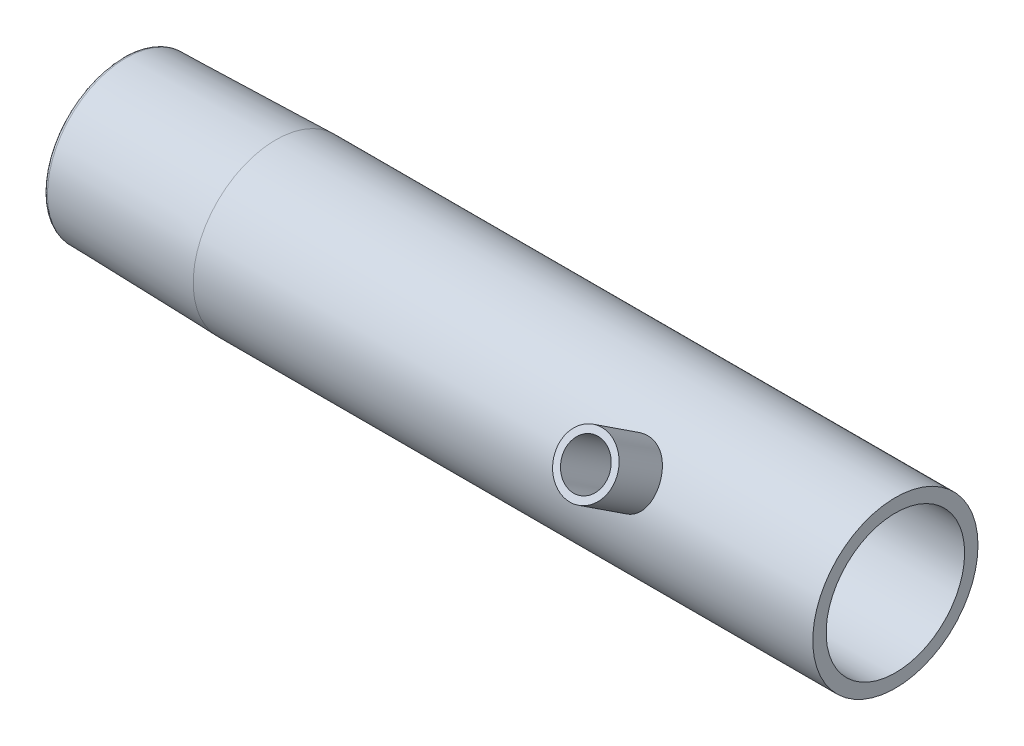
ISO-10303-21;
HEADER;
FILE_DESCRIPTION(('STEP AP214'),'2;1');
FILE_NAME('part.step','',(''),(''),'','','');
FILE_SCHEMA(('AUTOMOTIVE_DESIGN { 1 0 10303 214 1 1 1 1 }'));
ENDSEC;
DATA;
#1=APPLICATION_CONTEXT('core data for automotive mechanical design processes');
#2=APPLICATION_PROTOCOL_DEFINITION('international standard','automotive_design',2000,#1);
#3=PRODUCT_CONTEXT('',#1,'mechanical');
#4=PRODUCT('Part','Part','',(#3));
#5=PRODUCT_RELATED_PRODUCT_CATEGORY('part','',(#4));
#6=PRODUCT_DEFINITION_FORMATION('','',#4);
#7=PRODUCT_DEFINITION_CONTEXT('part definition',#1,'design');
#8=PRODUCT_DEFINITION('design','',#6,#7);
#9=PRODUCT_DEFINITION_SHAPE('','',#8);
#10=(LENGTH_UNIT() NAMED_UNIT(*) SI_UNIT(.MILLI.,.METRE.));
#11=(NAMED_UNIT(*) PLANE_ANGLE_UNIT() SI_UNIT($,.RADIAN.));
#12=(NAMED_UNIT(*) SI_UNIT($,.STERADIAN.) SOLID_ANGLE_UNIT());
#13=UNCERTAINTY_MEASURE_WITH_UNIT(LENGTH_MEASURE(1.E-05),#10,'distance_accuracy_value','');
#14=(GEOMETRIC_REPRESENTATION_CONTEXT(3) GLOBAL_UNCERTAINTY_ASSIGNED_CONTEXT((#13)) GLOBAL_UNIT_ASSIGNED_CONTEXT((#10,
#11,#12)) REPRESENTATION_CONTEXT('',''));
#15=CARTESIAN_POINT('',(0.,0.,0.));
#16=DIRECTION('',(0.,0.,1.));
#17=DIRECTION('',(1.,0.,0.));
#18=AXIS2_PLACEMENT_3D('',#15,#16,#17);
#19=CARTESIAN_POINT('',(0.,5.12249620092513,7.80398985559965));
#20=DIRECTION('',(0.,0.548740889149092,0.835992485956581));
#21=DIRECTION('',(0.,-0.835992485956581,0.548740889149092));
#22=AXIS2_PLACEMENT_3D('',#19,#20,#21);
#23=PLANE('',#22);
#24=DIRECTION('',(1.,0.,0.));
#25=VECTOR('',#24,1.);
#26=CARTESIAN_POINT('',(-44.1959971224861,3.64873486396762,8.77135872556055));
#27=LINE('',#26,#25);
#28=CARTESIAN_POINT('',(67.9620369406274,3.64873486361647,8.77135872502559));
#29=VERTEX_POINT('',#28);
#30=CARTESIAN_POINT('',(66.9470794203548,3.6487348639676,8.77135872556056));
#31=VERTEX_POINT('',#30);
#32=EDGE_CURVE('E56',#29,#31,#27,.F.);
#33=ORIENTED_EDGE('',*,*,#32,.T.);
#34=CARTESIAN_POINT('',(64.1551590265183,4.67523033592266,8.09757271976458));
#35=DIRECTION('',(0.,0.548740889149092,0.835992485956581));
#36=DIRECTION('',(0.,-0.835992485956581,0.548740889149092));
#37=AXIS2_PLACEMENT_3D('',#34,#35,#36);
#38=CIRCLE('',#37,3.05000000345426);
#39=CARTESIAN_POINT('',(66.1606901891249,6.59625753613996,6.83662098678264));
#40=VERTEX_POINT('',#39);
#41=EDGE_CURVE('E12',#31,#40,#38,.T.);
#42=ORIENTED_EDGE('',*,*,#41,.T.);
#43=DIRECTION('',(1.,0.,0.));
#44=VECTOR('',#43,1.);
#45=CARTESIAN_POINT('',(-44.1959971224861,6.59625753613994,6.83662098678265));
#46=LINE('',#45,#44);
#47=CARTESIAN_POINT('',(67.4292474866354,6.59625753679708,6.8366209877838));
#48=VERTEX_POINT('',#47);
#49=EDGE_CURVE('E84',#40,#48,#46,.T.);
#50=ORIENTED_EDGE('',*,*,#49,.T.);
#51=CARTESIAN_POINT('',(64.1551590265184,4.67523033984378,8.09757271719077));
#52=DIRECTION('',(0.,0.548740888713413,0.835992486242558));
#53=DIRECTION('',(0.,-0.835992486242558,0.548740888713414));
#54=AXIS2_PLACEMENT_3D('',#51,#52,#53);
#55=CIRCLE('',#54,4.00000000000001);
#56=EDGE_CURVE('E103',#29,#48,#55,.T.);
#57=ORIENTED_EDGE('',*,*,#56,.F.);
#58=EDGE_LOOP('',(#33,#42,#50,#57));
#59=FACE_BOUND('',#58,.T.);
#60=ADVANCED_FACE('F34',(#59),#23,.F.);
#61=CARTESIAN_POINT('',(-44.1959971224861,0.,0.));
#62=DIRECTION('',(1.,0.,0.));
#63=DIRECTION('',(0.,0.,-1.));
#64=AXIS2_PLACEMENT_3D('',#61,#62,#63);
#65=CYLINDRICAL_SURFACE('',#64,9.5);
#66=CARTESIAN_POINT('',(91.,0.,0.));
#67=DIRECTION('',(1.,0.,0.));
#68=DIRECTION('',(0.,0.,-1.));
#69=AXIS2_PLACEMENT_3D('',#66,#67,#68);
#70=CIRCLE('',#69,9.5);
#71=CARTESIAN_POINT('',(91.,0.,-9.5));
#72=VERTEX_POINT('',#71);
#73=EDGE_CURVE('E114',#72,#72,#70,.T.);
#74=ORIENTED_EDGE('',*,*,#73,.T.);
#75=EDGE_LOOP('',(#74));
#76=FACE_BOUND('',#75,.T.);
#77=CARTESIAN_POINT('',(-14.5,0.,0.));
#78=DIRECTION('',(1.,0.,0.));
#79=DIRECTION('',(0.,0.,-1.));
#80=AXIS2_PLACEMENT_3D('',#77,#78,#79);
#81=CIRCLE('',#80,9.5);
#82=CARTESIAN_POINT('',(-14.5,0.,-9.5));
#83=VERTEX_POINT('',#82);
#84=EDGE_CURVE('E163',#83,#83,#81,.F.);
#85=ORIENTED_EDGE('',*,*,#84,.T.);
#86=EDGE_LOOP('',(#85));
#87=FACE_BOUND('',#86,.T.);
#88=ORIENTED_EDGE('',*,*,#49,.F.);
#89=CARTESIAN_POINT('',(64.1551590265183,1.83055754077954,9.32196648191223));
#90=CARTESIAN_POINT('',(64.3194069724884,1.83055773345864,9.32196664932546));
#91=CARTESIAN_POINT('',(64.4836578336241,1.84468800655994,9.31922501446892));
#92=CARTESIAN_POINT('',(64.8072477269291,1.90037290600807,9.30802703055967));
#93=CARTESIAN_POINT('',(64.9665854088889,1.94193500191815,9.29956912497684));
#94=CARTESIAN_POINT('',(65.2755389804409,2.05008597221565,9.27632301268519));
#95=CARTESIAN_POINT('',(65.425177607279,2.11661363336963,9.26155027712532));
#96=CARTESIAN_POINT('',(65.7116270010047,2.27161345908223,9.22475446388282));
#97=CARTESIAN_POINT('',(65.8484348016597,2.36009068079576,9.20272971496096));
#98=CARTESIAN_POINT('',(66.1120447283323,2.55989235971579,9.14921254717054));
#99=CARTESIAN_POINT('',(66.2381342148522,2.67205592676818,9.11734362684915));
#100=CARTESIAN_POINT('',(66.4703573591307,2.91254646236125,9.04338918184039));
#101=CARTESIAN_POINT('',(66.5764859793552,3.04087749748576,9.0013010842572));
#102=CARTESIAN_POINT('',(66.7703174290475,3.31542306270465,8.903934977784));
#103=CARTESIAN_POINT('',(66.8570194696255,3.4621723122406,8.84816338484763));
#104=CARTESIAN_POINT('',(67.003090689641,3.76379174088539,8.72412854086039));
#105=CARTESIAN_POINT('',(67.0624651182799,3.91866035402157,8.6558676923211));
#106=CARTESIAN_POINT('',(67.1503456740538,4.2269109975065,8.50949542326519));
#107=CARTESIAN_POINT('',(67.1796595559945,4.38021582383399,8.43170837989692));
#108=CARTESIAN_POINT('',(67.2088784079783,4.68443562603211,8.26655782104833));
#109=CARTESIAN_POINT('',(67.2087932910646,4.83535139030493,8.17919754349793));
#110=CARTESIAN_POINT('',(67.1796994389063,5.12280835819424,8.00212259418471));
#111=CARTESIAN_POINT('',(67.1520967079458,5.25969170728326,7.91272873072002));
#112=CARTESIAN_POINT('',(67.0708569378575,5.52337532977957,7.7309749636817));
#113=CARTESIAN_POINT('',(67.0172201788045,5.65017571164258,7.63861509202645));
#114=CARTESIAN_POINT('',(66.8858071337893,5.89046024467732,7.45488423067936));
#115=CARTESIAN_POINT('',(66.8081190393953,6.00399099132725,7.36351087020469));
#116=CARTESIAN_POINT('',(66.6307571019932,6.21636000428591,7.18513241910146));
#117=CARTESIAN_POINT('',(66.5310788234006,6.31519529967008,7.09812821411689));
#118=CARTESIAN_POINT('',(66.3083539560822,6.50018550396126,6.92920354138024));
#119=CARTESIAN_POINT('',(66.1845920467289,6.58575185262156,6.84758112589768));
#120=CARTESIAN_POINT('',(65.9194241209659,6.73882427517402,6.69699974715508));
#121=CARTESIAN_POINT('',(65.7780154927287,6.80632767097356,6.62804266218728));
#122=CARTESIAN_POINT('',(65.4782278841157,6.92377440386712,6.5052852072969));
#123=CARTESIAN_POINT('',(65.3195708858579,6.97334812217903,6.45180796602954));
#124=CARTESIAN_POINT('',(64.9920601737962,7.05252972857976,6.36516322453285));
#125=CARTESIAN_POINT('',(64.8232088100542,7.08214219924338,6.33199106295486));
#126=CARTESIAN_POINT('',(64.484636814317,7.12058089435784,6.28873224356802));
#127=CARTESIAN_POINT('',(64.3150452049205,7.12991190010147,6.27808514866403));
#128=CARTESIAN_POINT('',(63.9759725548951,7.12917490255555,6.27892259814476));
#129=CARTESIAN_POINT('',(63.8064915030204,7.11910934527435,6.29040435196562));
#130=CARTESIAN_POINT('',(63.4764961357015,7.08016214804403,6.33420220466674));
#131=CARTESIAN_POINT('',(63.3158653681566,7.05171653728768,6.36603532834494));
#132=CARTESIAN_POINT('',(63.0038023736153,6.97673138342758,6.44812281671684));
#133=CARTESIAN_POINT('',(62.8523714427111,6.93018929765779,6.49837977001516));
#134=CARTESIAN_POINT('',(62.5595022044709,6.81828445288229,6.61571460421642));
#135=CARTESIAN_POINT('',(62.418338218988,6.75254936542967,6.6831214847471));
#136=CARTESIAN_POINT('',(62.1530882958223,6.60326618003022,6.83065634049128));
#137=CARTESIAN_POINT('',(62.0290056659241,6.51971463991062,6.91078677315438));
#138=CARTESIAN_POINT('',(61.7979096829791,6.33309286362322,7.08225969826534));
#139=CARTESIAN_POINT('',(61.6914651550322,6.22954557127635,7.1738515073077));
#140=CARTESIAN_POINT('',(61.5030439623949,6.0060002709448,7.36201509774213));
#141=CARTESIAN_POINT('',(61.4210642517885,5.88600431356706,7.45858625743837));
#142=CARTESIAN_POINT('',(61.2852488693817,5.6338317549295,7.65079440359298));
#143=CARTESIAN_POINT('',(61.2309923552515,5.50187546135367,7.74642231926321));
#144=CARTESIAN_POINT('',(61.1505174258389,5.22739732820681,7.9342251620966));
#145=CARTESIAN_POINT('',(61.1242912972657,5.08487840676722,8.02640103243946));
#146=CARTESIAN_POINT('',(61.1010731525341,4.79871229787552,8.20057259184177));
#147=CARTESIAN_POINT('',(61.1030386804199,4.65530055422768,8.28281835106436));
#148=CARTESIAN_POINT('',(61.1333610846331,4.36657039516593,8.43860038578781));
#149=CARTESIAN_POINT('',(61.1617181562693,4.22125196564956,8.51213659682975));
#150=CARTESIAN_POINT('',(61.243681640571,3.93283344637632,8.64918302578005));
#151=CARTESIAN_POINT('',(61.2973198200523,3.78973638219546,8.71268049513773));
#152=CARTESIAN_POINT('',(61.4280519211532,3.51009663388764,8.82905368234405));
#153=CARTESIAN_POINT('',(61.5051513400782,3.37355549459881,8.88192690595322));
#154=CARTESIAN_POINT('',(61.684784694537,3.10483954837493,8.97949635659194));
#155=CARTESIAN_POINT('',(61.7883369454293,2.97316518160799,9.02369636416609));
#156=CARTESIAN_POINT('',(62.01622152095,2.72555863264227,9.1015497559261));
#157=CARTESIAN_POINT('',(62.1405614181133,2.60963221511004,9.1351992838864));
#158=CARTESIAN_POINT('',(62.4118415797248,2.3940118682474,9.19410953972507));
#159=CARTESIAN_POINT('',(62.5594188184141,2.29502507354959,9.21903676850579));
#160=CARTESIAN_POINT('',(62.8700663967209,2.1229585315452,9.26017914726139));
#161=CARTESIAN_POINT('',(63.0331284856367,2.04986508476511,9.27639890647253));
#162=CARTESIAN_POINT('',(63.3544663767341,1.93896085887627,9.30018031472613));
#163=CARTESIAN_POINT('',(63.5117800157281,1.89850355770825,9.30840621204269));
#164=CARTESIAN_POINT('',(63.8311157432677,1.84430702454465,9.31929812660428));
#165=CARTESIAN_POINT('',(63.9931359665313,1.83055735071046,9.32196631676677));
#166=CARTESIAN_POINT('',(64.1551590265183,1.83055754077954,9.32196648191223));
#167=B_SPLINE_CURVE_WITH_KNOTS('',3,(#89,#90,#91,#92,#93,#94,#95,#96,#97,#98,#99,#100,#101,#102,
#103,#104,#105,#106,#107,#108,#109,#110,#111,#112,#113,#114,#115,#116,#117,#118,#119,#120,#121,
#122,#123,#124,#125,#126,#127,#128,#129,#130,#131,#132,#133,#134,#135,#136,#137,#138,#139,#140,
#141,#142,#143,#144,#145,#146,#147,#148,#149,#150,#151,#152,#153,#154,#155,#156,#157,#158,#159,
#160,#161,#162,#163,#164,#165,#166),.UNSPECIFIED.,.T.,.F.,(4,2,2,2,2,2,2,2,2,2,2,2,2,2,2,2,2,2,
2,2,2,2,2,2,2,2,2,2,2,2,2,2,2,2,2,2,2,2,4),(0.,0.492135466083825,0.984404993780647,
1.47547532622363,1.96665890598645,2.4796219845228,2.99271434661773,3.52809737600957,
4.063377523838,4.58386417362068,5.10417532077422,5.59919727099587,6.09421389587716,
6.58743646969399,7.08075862129555,7.59193934644867,8.10319581955723,8.62446050859779,
9.145605488252,9.65362374604057,10.1615779442544,10.6579036165767,11.1542990509234,
11.6610487501916,12.1678964433209,12.6888007234112,13.2096401228497,13.7223188798469,
14.2348565235799,14.7284922868668,15.2221317032981,15.7163930596258,16.2107703177826,
16.7281989107553,17.2458164052456,17.7814864332896,18.3168726279721,18.802531592612,
19.2880006416893),.UNSPECIFIED.);
#168=CARTESIAN_POINT('',(62.1496278639117,6.59625753613994,6.83662098678265));
#169=VERTEX_POINT('',#168);
#170=EDGE_CURVE('E75',#40,#169,#167,.T.);
#171=ORIENTED_EDGE('',*,*,#170,.T.);
#172=CARTESIAN_POINT('',(60.8810705619507,6.59625753149576,6.83662099126356));
#173=VERTEX_POINT('',#172);
#174=EDGE_CURVE('E82',#173,#169,#46,.T.);
#175=ORIENTED_EDGE('',*,*,#174,.F.);
#176=CARTESIAN_POINT('',(64.1551590265184,7.75062222271309,5.49343746308139));
#177=CARTESIAN_POINT('',(64.2634039975694,7.75062198709224,5.49343853714921));
#178=CARTESIAN_POINT('',(64.3716844252395,7.74789187453013,5.49729601828849));
#179=CARTESIAN_POINT('',(64.5874705631577,7.7369725093092,5.51265289230812));
#180=CARTESIAN_POINT('',(64.6949757481369,7.7287798531093,5.52415704958071));
#181=CARTESIAN_POINT('',(64.9085986483449,7.70691874799722,5.55461583841171));
#182=CARTESIAN_POINT('',(65.0147130535854,7.69323906682743,5.57358575129528));
#183=CARTESIAN_POINT('',(65.2245837190653,7.6604223653768,5.61860262365278));
#184=CARTESIAN_POINT('',(65.3283389906693,7.64128310107108,5.64465249295709));
#185=CARTESIAN_POINT('',(65.6342136706425,7.57585180953773,5.73252585674359));
#186=CARTESIAN_POINT('',(65.8319139570756,7.52144789308935,5.80421765114698));
#187=CARTESIAN_POINT('',(66.2102030840586,7.39115820782081,5.96923466136944));
#188=CARTESIAN_POINT('',(66.3907962056611,7.31527783252085,6.06255444454913));
#189=CARTESIAN_POINT('',(66.7387373668842,7.13821211632154,6.27019301663329));
#190=CARTESIAN_POINT('',(66.9051518499839,7.03605952987413,6.3852555967431));
#191=CARTESIAN_POINT('',(67.2113682985125,6.80852679682451,6.62733174888644));
#192=CARTESIAN_POINT('',(67.3511635754828,6.68314082807496,6.75434831258242));
#193=CARTESIAN_POINT('',(67.6030777143678,6.40688876350902,7.0170401558563));
#194=CARTESIAN_POINT('',(67.7145115405932,6.25551779228611,7.15284521321322));
#195=CARTESIAN_POINT('',(67.9016504325316,5.93152439919941,7.42371140163066));
#196=CARTESIAN_POINT('',(67.9773730290384,5.75891245720452,7.55877286547327));
#197=CARTESIAN_POINT('',(68.0870179028028,5.40652474093622,7.81435845952588));
#198=CARTESIAN_POINT('',(68.1230341880607,5.22768404018343,7.93527328228412));
#199=CARTESIAN_POINT('',(68.1593913489552,4.85951185345095,8.16592167438352));
#200=CARTESIAN_POINT('',(68.1597420133898,4.67018326025528,8.27565830343509));
#201=CARTESIAN_POINT('',(68.1259868007827,4.2956756067799,8.47586298924127));
#202=CARTESIAN_POINT('',(68.0934424455971,4.11069760604119,8.56697909119791));
#203=CARTESIAN_POINT('',(67.9978444242122,3.7419450913675,8.7343504148788));
#204=CARTESIAN_POINT('',(67.9347863365432,3.55817075575736,8.81060348068761));
#205=CARTESIAN_POINT('',(67.7777961727736,3.19062912797163,8.95041416435019));
#206=CARTESIAN_POINT('',(67.6828582975233,3.00708840228956,9.01343235685735));
#207=CARTESIAN_POINT('',(67.4656780805373,2.65193743366079,9.12424739095135));
#208=CARTESIAN_POINT('',(67.3434239499982,2.48033238381697,9.17203763898598));
#209=CARTESIAN_POINT('',(67.0633707195354,2.14045441998713,9.25751801929894));
#210=CARTESIAN_POINT('',(66.9034739782512,1.97361879470524,9.29405280343078));
#211=CARTESIAN_POINT('',(66.5582290371377,1.66553180647392,9.35417990129739));
#212=CARTESIAN_POINT('',(66.3728691237624,1.52429228797759,9.3777662334019));
#213=CARTESIAN_POINT('',(66.076321511179,1.3349906474865,9.40595709831285));
#214=CARTESIAN_POINT('',(65.9729121830735,1.27502317236756,9.41421411842794));
#215=CARTESIAN_POINT('',(65.7610779403749,1.16444295428364,9.42852997635374));
#216=CARTESIAN_POINT('',(65.6526553516432,1.11382592663522,9.43458982221389));
#217=CARTESIAN_POINT('',(65.4315950202962,1.02283451416495,9.44488798188556));
#218=CARTESIAN_POINT('',(65.3189602420832,0.982453075935579,9.44912755146621));
#219=CARTESIAN_POINT('',(65.0902908840291,0.912676452743076,9.45612262069486));
#220=CARTESIAN_POINT('',(64.9742567712395,0.883279766093779,9.45887832321975));
#221=CARTESIAN_POINT('',(64.7508817206189,0.838335133991854,9.46296216335132));
#222=CARTESIAN_POINT('',(64.6437522102729,0.82174306408154,9.46440037131722));
#223=CARTESIAN_POINT('',(64.4284217745109,0.798412862812156,9.46639714976171));
#224=CARTESIAN_POINT('',(64.3202209483648,0.791673826899041,9.46695580098804));
#225=CARTESIAN_POINT('',(64.1036864022692,0.788189689188518,9.46724688273425));
#226=CARTESIAN_POINT('',(63.9953527370312,0.791441335534166,9.4669795820922));
#227=CARTESIAN_POINT('',(63.7794753989355,0.807848817135286,9.46559211360599));
#228=CARTESIAN_POINT('',(63.671931699218,0.821004314059169,9.46447197489616));
#229=CARTESIAN_POINT('',(63.3693289670341,0.87204052497995,9.45995425886502));
#230=CARTESIAN_POINT('',(63.1761109684623,0.921392475893746,9.45543630061104));
#231=CARTESIAN_POINT('',(62.8001138568648,1.04975602374062,9.44203902210623));
#232=CARTESIAN_POINT('',(62.617337544093,1.12877553430498,9.43315853798448));
#233=CARTESIAN_POINT('',(62.2555624494836,1.31787438285169,9.40865479422767));
#234=CARTESIAN_POINT('',(62.0773878715312,1.4294807849242,9.39267256563568));
#235=CARTESIAN_POINT('',(61.7397349598669,1.67673835811389,9.35169732569764));
#236=CARTESIAN_POINT('',(61.5802661664221,1.81240171085502,9.32669974262097));
#237=CARTESIAN_POINT('',(61.2661577719757,2.11932829002289,9.2620538453914));
#238=CARTESIAN_POINT('',(61.1140040052469,2.29286952521845,9.22109070197722));
#239=CARTESIAN_POINT('',(60.8394792125614,2.6579671069953,9.12255170195014));
#240=CARTESIAN_POINT('',(60.7171157234617,2.84952799553912,9.06497164934126));
#241=CARTESIAN_POINT('',(60.5035818736558,3.24868139565714,8.92980147100999));
#242=CARTESIAN_POINT('',(60.4131412572629,3.45653057790463,8.85180652899352));
#243=CARTESIAN_POINT('',(60.2711411453456,3.87700097519717,8.67586630993364));
#244=CARTESIAN_POINT('',(60.2195557449687,4.08961891334392,8.57793438035116));
#245=CARTESIAN_POINT('',(60.1604504645186,4.49563039269543,8.37180920390217));
#246=CARTESIAN_POINT('',(60.1498915437125,4.68926121236346,8.26495316904344));
#247=CARTESIAN_POINT('',(60.1653322450405,5.06744892308822,8.0386233516165));
#248=CARTESIAN_POINT('',(60.1913205505962,5.25200860464439,7.91915348542108));
#249=CARTESIAN_POINT('',(60.2765877122992,5.59674215197516,7.67907529301685));
#250=CARTESIAN_POINT('',(60.3339363649787,5.75770121210912,7.55889915497486));
#251=CARTESIAN_POINT('',(60.4786125042775,6.06336481868784,7.3159923709175));
#252=CARTESIAN_POINT('',(60.5659438280271,6.20806728149396,7.19326139982844));
#253=CARTESIAN_POINT('',(60.7708874082573,6.48300551199603,6.94663608098251));
#254=CARTESIAN_POINT('',(60.8892995749741,6.61270438615047,6.82281008572057));
#255=CARTESIAN_POINT('',(61.151928784006,6.85154879154866,6.58293071451157));
#256=CARTESIAN_POINT('',(61.2961534675711,6.96068821691189,6.46687965418873));
#257=CARTESIAN_POINT('',(61.6170565419464,7.16430742182183,6.24077904919747));
#258=CARTESIAN_POINT('',(61.7952216661589,7.25740104740609,6.13158960346817));
#259=CARTESIAN_POINT('',(62.173056003367,7.41979148437333,5.93406493680654));
#260=CARTESIAN_POINT('',(62.372738518315,7.48907346335909,5.84574272484819));
#261=CARTESIAN_POINT('',(62.6851789008481,7.57521685449589,5.73309066412089));
#262=CARTESIAN_POINT('',(62.7920188766812,7.60104794558258,5.69872963846632));
#263=CARTESIAN_POINT('',(63.0090727701289,7.64659334451901,5.63747056641658));
#264=CARTESIAN_POINT('',(63.1192851429494,7.6663104082683,5.61056915817672));
#265=CARTESIAN_POINT('',(63.341991093795,7.69957069115296,5.56483678720523));
#266=CARTESIAN_POINT('',(63.4544784657368,7.71312882210889,5.54598633843156));
#267=CARTESIAN_POINT('',(63.6810524734232,7.73411989203259,5.51667641350057));
#268=CARTESIAN_POINT('',(63.7951379078724,7.74155720467567,5.50621094593564));
#269=CARTESIAN_POINT('',(63.9504114866988,7.74749555770486,5.49784652088849));
#270=CARTESIAN_POINT('',(63.9913329428235,7.74866791628535,5.49619388710063));
#271=CARTESIAN_POINT('',(64.0732209146616,7.75023129607767,5.49398915112802));
#272=CARTESIAN_POINT('',(64.1141874306841,7.75062231189748,5.49343705653804));
#273=CARTESIAN_POINT('',(64.1551590265184,7.75062222271309,5.49343746308139));
#274=B_SPLINE_CURVE_WITH_KNOTS('',3,(#176,#177,#178,#179,#180,#181,#182,#183,#184,#185,#186,
#187,#188,#189,#190,#191,#192,#193,#194,#195,#196,#197,#198,#199,#200,#201,#202,#203,#204,#205,
#206,#207,#208,#209,#210,#211,#212,#213,#214,#215,#216,#217,#218,#219,#220,#221,#222,#223,#224,
#225,#226,#227,#228,#229,#230,#231,#232,#233,#234,#235,#236,#237,#238,#239,#240,#241,#242,#243,
#244,#245,#246,#247,#248,#249,#250,#251,#252,#253,#254,#255,#256,#257,#258,#259,#260,#261,#262,
#263,#264,#265,#266,#267,#268,#269,#270,#271,#272,#273),.UNSPECIFIED.,.T.,.F.,(4,2,2,2,2,2,2,2,
2,2,2,2,2,2,2,2,2,2,2,2,2,2,2,2,2,2,2,2,2,2,2,2,2,2,2,2,2,2,2,2,2,2,2,2,2,2,2,2,4),(0.,
0.324693111146145,0.649588717758692,0.97515282670225,1.30085094390926,1.94932166532008,
2.59762967642284,3.27448870198176,3.95151757434006,4.64361089944877,5.33536411845194,
5.98857302329441,6.64160264772157,7.26502422896128,7.88853617166019,8.53392891251709,
9.1796007236277,9.87842610906837,10.5775740508351,10.9366408345864,11.295542671724,
11.6541965108673,12.0128013017719,12.337607021129,12.6623829199477,12.9870531189914,
13.311712227278,13.9072294354697,14.5029056070466,15.1328977669799,15.7632098492823,
16.4632508846283,17.1634688447796,17.8787900666276,18.5936339591886,19.2543860446229,
19.914933578105,20.5387745757695,21.1626954413035,21.8045915403395,22.4466779743951,
23.1298781571321,23.8135031407399,24.1586203242226,24.5035817191476,24.8477033932604,
25.191578958702,25.314477075696,25.4373760408016),.UNSPECIFIED.);
#275=CARTESIAN_POINT('',(60.3482811135023,3.64873486078368,8.77135872688501));
#276=VERTEX_POINT('',#275);
#277=EDGE_CURVE('E105',#276,#173,#274,.T.);
#278=ORIENTED_EDGE('',*,*,#277,.F.);
#279=CARTESIAN_POINT('',(61.3632386326818,3.64873486396761,8.77135872556055));
#280=VERTEX_POINT('',#279);
#281=EDGE_CURVE('E91',#280,#276,#27,.F.);
#282=ORIENTED_EDGE('',*,*,#281,.F.);
#283=EDGE_CURVE('E49',#280,#31,#167,.T.);
#284=ORIENTED_EDGE('',*,*,#283,.T.);
#285=ORIENTED_EDGE('',*,*,#32,.F.);
#286=EDGE_CURVE('E107',#48,#29,#274,.T.);
#287=ORIENTED_EDGE('',*,*,#286,.F.);
#288=EDGE_LOOP('',(#88,#171,#175,#278,#282,#284,#285,#287));
#289=FACE_BOUND('',#288,.T.);
#290=ADVANCED_FACE('F80',(#76,#87,#289),#65,.F.);
#291=CARTESIAN_POINT('',(91.,0.,0.));
#292=DIRECTION('',(-1.,0.,0.));
#293=DIRECTION('',(0.,0.,1.));
#294=AXIS2_PLACEMENT_3D('',#291,#292,#293);
#295=CYLINDRICAL_SURFACE('',#294,11.335);
#296=CARTESIAN_POINT('',(6.,0.,0.));
#297=DIRECTION('',(1.,0.,0.));
#298=DIRECTION('',(0.,0.,-1.));
#299=AXIS2_PLACEMENT_3D('',#296,#297,#298);
#300=CIRCLE('',#299,11.335);
#301=CARTESIAN_POINT('',(6.,0.,-11.335));
#302=VERTEX_POINT('',#301);
#303=EDGE_CURVE('E175',#302,#302,#300,.T.);
#304=ORIENTED_EDGE('',*,*,#303,.T.);
#305=EDGE_LOOP('',(#304));
#306=FACE_BOUND('',#305,.T.);
#307=CARTESIAN_POINT('',(91.,0.,0.));
#308=DIRECTION('',(1.,0.,0.));
#309=DIRECTION('',(0.,0.,-1.));
#310=AXIS2_PLACEMENT_3D('',#307,#308,#309);
#311=CIRCLE('',#310,11.335);
#312=CARTESIAN_POINT('',(91.,0.,-11.335));
#313=VERTEX_POINT('',#312);
#314=EDGE_CURVE('E174',#313,#313,#311,.T.);
#315=ORIENTED_EDGE('',*,*,#314,.F.);
#316=EDGE_LOOP('',(#315));
#317=FACE_BOUND('',#316,.T.);
#318=CARTESIAN_POINT('',(64.1551590265184,8.81893993653854,7.12099174242786));
#319=CARTESIAN_POINT('',(63.9358504112188,8.81894118699237,7.12098760052729));
#320=CARTESIAN_POINT('',(63.7165666552676,8.80703001642506,7.13581689427552));
#321=CARTESIAN_POINT('',(63.2844763942639,8.75951621878987,7.19405935658194));
#322=CARTESIAN_POINT('',(63.0716700534636,8.72391299146908,7.23747324934835));
#323=CARTESIAN_POINT('',(62.6587944571386,8.62942035944659,7.34987475500076));
#324=CARTESIAN_POINT('',(62.4587046740855,8.57056965027949,7.41881985920455));
#325=CARTESIAN_POINT('',(62.0758475336495,8.43000000090001,7.57816422204819));
#326=CARTESIAN_POINT('',(61.8930841985125,8.34827576803476,7.66856844532867));
#327=CARTESIAN_POINT('',(61.5439560912248,8.15963582542243,7.86905586376653));
#328=CARTESIAN_POINT('',(61.3782609883198,8.05202816827545,7.97965491058909));
#329=CARTESIAN_POINT('',(61.0740427469196,7.8139066452479,8.21296725156195));
#330=CARTESIAN_POINT('',(60.9355220405441,7.68339073104771,8.33568162856313));
#331=CARTESIAN_POINT('',(60.6876800043368,7.39881057625761,8.58933269582094));
#332=CARTESIAN_POINT('',(60.5788215023217,7.24442621035243,8.72036424318267));
#333=CARTESIAN_POINT('',(60.3966611867905,6.91626109046951,8.9828511496676));
#334=CARTESIAN_POINT('',(60.3233476935267,6.74248673097672,9.11430635526889));
#335=CARTESIAN_POINT('',(60.2170744137925,6.38701556761716,9.36663382287878));
#336=CARTESIAN_POINT('',(60.1826065238542,6.20592084727825,9.48771908200752));
#337=CARTESIAN_POINT('',(60.1499094600209,5.83464974945419,9.720444800075));
#338=CARTESIAN_POINT('',(60.1516730731697,5.64447518710213,9.83208713446454));
#339=CARTESIAN_POINT('',(60.1904131372204,5.26699232897019,10.0392193668288));
#340=CARTESIAN_POINT('',(60.2262627242257,5.07978659017226,10.1351113738014));
#341=CARTESIAN_POINT('',(60.3300130861787,4.70777718075608,10.3131769516728));
#342=CARTESIAN_POINT('',(60.3979179693744,4.52297382115017,10.3953487623458));
#343=CARTESIAN_POINT('',(60.5657940881125,4.15602463533267,10.5475239490269));
#344=CARTESIAN_POINT('',(60.6666112019588,3.97409868516941,10.6171214395759));
#345=CARTESIAN_POINT('',(60.8967631002239,3.62377815957333,10.7417448105944));
#346=CARTESIAN_POINT('',(61.0261081580354,3.45538848866591,10.7967654259338));
#347=CARTESIAN_POINT('',(61.3186121908288,3.12789939266188,10.8963053026783));
#348=CARTESIAN_POINT('',(61.4833114729789,2.96992726141396,10.9400175364803));
#349=CARTESIAN_POINT('',(61.8374269817142,2.68079214859963,11.0144414679785));
#350=CARTESIAN_POINT('',(62.0268477978178,2.54963415667337,11.0451507471901));
#351=CARTESIAN_POINT('',(62.4279087793306,2.31890926316622,11.0959013347789));
#352=CARTESIAN_POINT('',(62.639744237667,2.21965670378779,11.1158377370544));
#353=CARTESIAN_POINT('',(63.0782254792451,2.06016444581196,11.1465078444981));
#354=CARTESIAN_POINT('',(63.3048609011067,1.99989776902886,11.1572479151865));
#355=CARTESIAN_POINT('',(63.7497136992643,1.9250446495423,11.1703971493087));
#356=CARTESIAN_POINT('',(63.9674345239258,1.90759584151493,11.1733295277356));
#357=CARTESIAN_POINT('',(64.4025296947848,1.91109496027968,11.1727327775967));
#358=CARTESIAN_POINT('',(64.619904111649,1.93203366452222,11.1692052010268));
#359=CARTESIAN_POINT('',(65.0369746577459,2.00897014452732,11.1556105819032));
#360=CARTESIAN_POINT('',(65.2370144012098,2.06319260595065,11.1458737686702));
#361=CARTESIAN_POINT('',(65.6256466925394,2.20219649183873,11.119241453858));
#362=CARTESIAN_POINT('',(65.8142367763301,2.28698446724392,11.1023444175309));
#363=CARTESIAN_POINT('',(66.1839337457633,2.4877041994174,11.0591371345022));
#364=CARTESIAN_POINT('',(66.36433028247,2.60485772985678,11.0324401941097));
#365=CARTESIAN_POINT('',(66.7044468686979,2.86365189825979,10.9681121269282));
#366=CARTESIAN_POINT('',(66.8641586956952,3.0053022221818,10.9304766710618));
#367=CARTESIAN_POINT('',(67.1704973620222,3.31941305933991,10.8393878782012));
#368=CARTESIAN_POINT('',(67.3153124245731,3.49336937921498,10.7849788463875));
#369=CARTESIAN_POINT('',(67.573670307063,3.85796229796347,10.6599931182912));
#370=CARTESIAN_POINT('',(67.6872105100051,4.04860029095721,10.5894150699328));
#371=CARTESIAN_POINT('',(67.8800163502448,4.44135823006766,10.430801512264));
#372=CARTESIAN_POINT('',(67.9590781072712,4.6435386885244,10.3426665311649));
#373=CARTESIAN_POINT('',(68.0787433632743,5.05129827454696,10.1497475862319));
#374=CARTESIAN_POINT('',(68.1193643188717,5.25687581624354,10.0449712048097));
#375=CARTESIAN_POINT('',(68.1589931024294,5.6526259930634,9.82741766187296));
#376=CARTESIAN_POINT('',(68.1602296845171,5.84301120248371,9.71543092557027));
#377=CARTESIAN_POINT('',(68.1263680802766,6.21454955993371,9.48207225767904));
#378=CARTESIAN_POINT('',(68.0912764736319,6.39570437351884,9.36070202929182));
#379=CARTESIAN_POINT('',(67.9876681350306,6.73800785764307,9.11724561807427));
#380=CARTESIAN_POINT('',(67.9203072575404,6.8996227124579,8.99531881999994));
#381=CARTESIAN_POINT('',(67.7548201979835,7.20630329077521,8.75156123279054));
#382=CARTESIAN_POINT('',(67.6566898568047,7.35136677340929,8.62973045886825));
#383=CARTESIAN_POINT('',(67.4292938899923,7.6265181869461,8.38766916281973));
#384=CARTESIAN_POINT('',(67.2992295452294,7.75606958501563,8.26758023635017));
#385=CARTESIAN_POINT('',(67.0129603411295,7.99387139450191,8.03788691957087));
#386=CARTESIAN_POINT('',(66.8567480601093,8.10211573921003,7.92828551990228));
#387=CARTESIAN_POINT('',(66.5145989458779,8.30068936608152,7.72025836284732));
#388=CARTESIAN_POINT('',(66.3276622477231,8.39003037623067,7.62252927793604));
#389=CARTESIAN_POINT('',(65.9341484397299,8.54393307704784,7.44962324817499));
#390=CARTESIAN_POINT('',(65.7275711875424,8.60849458810395,7.37444646679437));
#391=CARTESIAN_POINT('',(65.2972996125836,8.71308129625261,7.25059753117069));
#392=CARTESIAN_POINT('',(65.0734049385393,8.75274753195832,7.2023142160525));
#393=CARTESIAN_POINT('',(64.6180488285203,8.80567154353332,7.13751909992975));
#394=CARTESIAN_POINT('',(64.3865900857488,8.81893861696495,7.12099611327502));
#395=CARTESIAN_POINT('',(64.1551590265184,8.81893993653854,7.12099174242786));
#396=B_SPLINE_CURVE_WITH_KNOTS('',3,(#318,#319,#320,#321,#322,#323,#324,#325,#326,#327,#328,
#329,#330,#331,#332,#333,#334,#335,#336,#337,#338,#339,#340,#341,#342,#343,#344,#345,#346,#347,
#348,#349,#350,#351,#352,#353,#354,#355,#356,#357,#358,#359,#360,#361,#362,#363,#364,#365,#366,
#367,#368,#369,#370,#371,#372,#373,#374,#375,#376,#377,#378,#379,#380,#381,#382,#383,#384,#385,
#386,#387,#388,#389,#390,#391,#392,#393,#394,#395),.UNSPECIFIED.,.T.,.F.,(4,2,2,2,2,2,2,2,2,2,2,
2,2,2,2,2,2,2,2,2,2,2,2,2,2,2,2,2,2,2,2,2,2,2,2,2,2,2,4),(0.,0.657076881367863,1.31417041081902,
1.97017478296489,2.62633107214468,3.30248815701933,3.97870573065265,4.66493813647296,
5.35094489985211,6.00928733054096,6.66749869989421,7.30467996576464,7.94194291578547,
8.59707759263556,9.25244858083788,9.94632902534483,10.6403384715211,11.3409896568092,
12.0411554721535,12.6930593345381,13.3448065983969,13.9644927612745,14.5843118171575,
15.2318120797757,15.8795689498553,16.5747093117907,17.2699078235626,17.9691632570956,
18.6681009942666,19.3274111961472,19.9866020060711,20.6237701578677,21.2610244729111,
21.9162180334414,22.5715978767488,23.2555859878118,23.9395790566056,24.6332206806324,
25.3266179666584),.UNSPECIFIED.);
#397=CARTESIAN_POINT('',(64.1551590265184,8.81893993653854,7.12099174242786));
#398=VERTEX_POINT('',#397);
#399=EDGE_CURVE('E93',#398,#398,#396,.T.);
#400=ORIENTED_EDGE('',*,*,#399,.F.);
#401=EDGE_LOOP('',(#400));
#402=FACE_BOUND('',#401,.T.);
#403=ADVANCED_FACE('F134',(#306,#317,#402),#295,.T.);
#404=CARTESIAN_POINT('',(-14.5,0.,0.));
#405=DIRECTION('',(-1.,0.,0.));
#406=DIRECTION('',(0.,0.,1.));
#407=AXIS2_PLACEMENT_3D('',#404,#405,#406);
#408=TOROIDAL_SURFACE('',#407,10.3223437744064,0.499999999999999);
#409=CARTESIAN_POINT('',(-15.,0.,0.));
#410=DIRECTION('',(-1.,0.,0.));
#411=DIRECTION('',(0.,0.,1.));
#412=AXIS2_PLACEMENT_3D('',#409,#410,#411);
#413=CIRCLE('',#412,10.3223437744064);
#414=CARTESIAN_POINT('',(-15.,0.,10.3223437744064));
#415=VERTEX_POINT('',#414);
#416=EDGE_CURVE('E166',#415,#415,#413,.T.);
#417=ORIENTED_EDGE('',*,*,#416,.F.);
#418=EDGE_LOOP('',(#417));
#419=FACE_BOUND('',#418,.T.);
#420=CARTESIAN_POINT('',(-14.5124960955801,0.,0.));
#421=DIRECTION('',(-1.,0.,0.));
#422=DIRECTION('',(0.,0.,1.));
#423=AXIS2_PLACEMENT_3D('',#420,#421,#422);
#424=CIRCLE('',#423,10.8221875976105);
#425=CARTESIAN_POINT('',(-14.5124960955801,0.,10.8221875976105));
#426=VERTEX_POINT('',#425);
#427=EDGE_CURVE('E169',#426,#426,#424,.T.);
#428=ORIENTED_EDGE('',*,*,#427,.T.);
#429=EDGE_LOOP('',(#428));
#430=FACE_BOUND('',#429,.T.);
#431=ADVANCED_FACE('F137',(#419,#430),#408,.T.);
#432=CARTESIAN_POINT('',(6.,0.,0.));
#433=DIRECTION('',(1.,0.,0.));
#434=DIRECTION('',(0.,0.,-1.));
#435=AXIS2_PLACEMENT_3D('',#432,#433,#434);
#436=CONICAL_SURFACE('',#435,11.335,0.0249947936189204);
#437=ORIENTED_EDGE('',*,*,#427,.F.);
#438=EDGE_LOOP('',(#437));
#439=FACE_BOUND('',#438,.T.);
#440=ORIENTED_EDGE('',*,*,#303,.F.);
#441=EDGE_LOOP('',(#440));
#442=FACE_BOUND('',#441,.T.);
#443=ADVANCED_FACE('F141',(#439,#442),#436,.T.);
#444=CARTESIAN_POINT('',(-15.,0.,0.));
#445=DIRECTION('',(1.,0.,0.));
#446=DIRECTION('',(0.,0.,-1.));
#447=AXIS2_PLACEMENT_3D('',#444,#445,#446);
#448=PLANE('',#447);
#449=CARTESIAN_POINT('',(-15.,0.,0.));
#450=DIRECTION('',(1.,0.,0.));
#451=DIRECTION('',(0.,0.,-1.));
#452=AXIS2_PLACEMENT_3D('',#449,#450,#451);
#453=CIRCLE('',#452,10.);
#454=CARTESIAN_POINT('',(-15.,0.,-10.));
#455=VERTEX_POINT('',#454);
#456=EDGE_CURVE('E165',#455,#455,#453,.T.);
#457=ORIENTED_EDGE('',*,*,#456,.T.);
#458=EDGE_LOOP('',(#457));
#459=FACE_BOUND('',#458,.T.);
#460=ORIENTED_EDGE('',*,*,#416,.T.);
#461=EDGE_LOOP('',(#460));
#462=FACE_BOUND('',#461,.T.);
#463=ADVANCED_FACE('F139',(#459,#462),#448,.F.);
#464=CARTESIAN_POINT('',(-14.5,0.,0.));
#465=DIRECTION('',(1.,0.,0.));
#466=DIRECTION('',(0.,0.,-1.));
#467=AXIS2_PLACEMENT_3D('',#464,#465,#466);
#468=TOROIDAL_SURFACE('',#467,10.,0.5);
#469=ORIENTED_EDGE('',*,*,#456,.F.);
#470=EDGE_LOOP('',(#469));
#471=FACE_BOUND('',#470,.T.);
#472=ORIENTED_EDGE('',*,*,#84,.F.);
#473=EDGE_LOOP('',(#472));
#474=FACE_BOUND('',#473,.T.);
#475=ADVANCED_FACE('F36',(#471,#474),#468,.T.);
#476=CARTESIAN_POINT('',(91.,0.,0.));
#477=DIRECTION('',(1.,0.,0.));
#478=DIRECTION('',(0.,0.,-1.));
#479=AXIS2_PLACEMENT_3D('',#476,#477,#478);
#480=PLANE('',#479);
#481=ORIENTED_EDGE('',*,*,#314,.T.);
#482=EDGE_LOOP('',(#481));
#483=FACE_BOUND('',#482,.T.);
#484=ORIENTED_EDGE('',*,*,#73,.F.);
#485=EDGE_LOOP('',(#484));
#486=FACE_BOUND('',#485,.T.);
#487=ADVANCED_FACE('F131',(#483,#486),#480,.T.);
#488=CARTESIAN_POINT('',(0.,10.0611641993459,15.3279222317827));
#489=DIRECTION('',(0.,0.548740889149092,0.835992485956581));
#490=DIRECTION('',(0.,-0.835992485956581,0.548740889149092));
#491=AXIS2_PLACEMENT_3D('',#488,#489,#490);
#492=PLANE('',#491);
#493=CARTESIAN_POINT('',(64.1551590265183,9.61389833826443,15.6215050933737));
#494=DIRECTION('',(0.,0.548740889149092,0.835992485956581));
#495=DIRECTION('',(0.,-0.835992485956581,0.548740889149092));
#496=AXIS2_PLACEMENT_3D('',#493,#494,#495);
#497=CIRCLE('',#496,3.05000000345426);
#498=CARTESIAN_POINT('',(64.1551590265183,7.06412125320912,17.2951648071739));
#499=VERTEX_POINT('',#498);
#500=EDGE_CURVE('E198',#499,#499,#497,.T.);
#501=ORIENTED_EDGE('',*,*,#500,.F.);
#502=EDGE_LOOP('',(#501));
#503=FACE_BOUND('',#502,.T.);
#504=CARTESIAN_POINT('',(64.1551590265184,9.6138983382645,15.6215050933738));
#505=DIRECTION('',(0.,0.548740888713413,0.835992486242558));
#506=DIRECTION('',(0.,-0.835992486242558,0.548740888713414));
#507=AXIS2_PLACEMENT_3D('',#504,#505,#506);
#508=CIRCLE('',#507,4.00000000000001);
#509=CARTESIAN_POINT('',(64.1551590265184,6.26992839329426,17.8164686482274));
#510=VERTEX_POINT('',#509);
#511=EDGE_CURVE('E85',#510,#510,#508,.T.);
#512=ORIENTED_EDGE('',*,*,#511,.T.);
#513=EDGE_LOOP('',(#512));
#514=FACE_BOUND('',#513,.T.);
#515=ADVANCED_FACE('F126',(#503,#514),#492,.T.);
#516=CARTESIAN_POINT('',(64.1551590265184,5.77271211727061,9.76955768967589));
#517=DIRECTION('',(0.,-0.548740888713413,-0.835992486242558));
#518=DIRECTION('',(0.,0.835992486242558,-0.548740888713413));
#519=AXIS2_PLACEMENT_3D('',#516,#517,#518);
#520=CYLINDRICAL_SURFACE('',#519,4.00000000000001);
#521=ORIENTED_EDGE('',*,*,#511,.F.);
#522=EDGE_LOOP('',(#521));
#523=FACE_BOUND('',#522,.T.);
#524=ORIENTED_EDGE('',*,*,#399,.T.);
#525=EDGE_LOOP('',(#524));
#526=FACE_BOUND('',#525,.T.);
#527=ADVANCED_FACE('F125',(#523,#526),#520,.T.);
#528=ORIENTED_EDGE('',*,*,#174,.T.);
#529=EDGE_CURVE('E38',#169,#280,#38,.T.);
#530=ORIENTED_EDGE('',*,*,#529,.T.);
#531=ORIENTED_EDGE('',*,*,#281,.T.);
#532=EDGE_CURVE('E90',#173,#276,#55,.T.);
#533=ORIENTED_EDGE('',*,*,#532,.F.);
#534=EDGE_LOOP('',(#528,#530,#531,#533));
#535=FACE_BOUND('',#534,.T.);
#536=ADVANCED_FACE('F88',(#535),#23,.F.);
#537=ORIENTED_EDGE('',*,*,#56,.T.);
#538=ORIENTED_EDGE('',*,*,#286,.T.);
#539=EDGE_LOOP('',(#537,#538));
#540=FACE_BOUND('',#539,.T.);
#541=ADVANCED_FACE('F119',(#540),#520,.T.);
#542=ORIENTED_EDGE('',*,*,#532,.T.);
#543=ORIENTED_EDGE('',*,*,#277,.T.);
#544=EDGE_LOOP('',(#542,#543));
#545=FACE_BOUND('',#544,.T.);
#546=ADVANCED_FACE('F124',(#545),#520,.T.);
#547=CARTESIAN_POINT('',(64.1551590265183,3.57774855762441,6.42558774785132));
#548=DIRECTION('',(0.,0.548740889149092,0.835992485956581));
#549=DIRECTION('',(0.,-0.83599248595658,0.548740889149092));
#550=AXIS2_PLACEMENT_3D('',#547,#548,#549);
#551=CYLINDRICAL_SURFACE('',#550,3.05000000345426);
#552=ORIENTED_EDGE('',*,*,#500,.T.);
#553=EDGE_LOOP('',(#552));
#554=FACE_BOUND('',#553,.T.);
#555=ORIENTED_EDGE('',*,*,#283,.F.);
#556=ORIENTED_EDGE('',*,*,#529,.F.);
#557=ORIENTED_EDGE('',*,*,#170,.F.);
#558=ORIENTED_EDGE('',*,*,#41,.F.);
#559=EDGE_LOOP('',(#555,#556,#557,#558));
#560=FACE_BOUND('',#559,.T.);
#561=ADVANCED_FACE('F74',(#554,#560),#551,.F.);
#562=CLOSED_SHELL('',(#60,#290,#403,#431,#443,#463,#475,#487,#515,#527,#536,#541,#546,#561));
#563=MANIFOLD_SOLID_BREP('B2',#562);
#564=ADVANCED_BREP_SHAPE_REPRESENTATION('',(#18,#563),#14);
#565=SHAPE_DEFINITION_REPRESENTATION(#9,#564);
ENDSEC;
END-ISO-10303-21;
